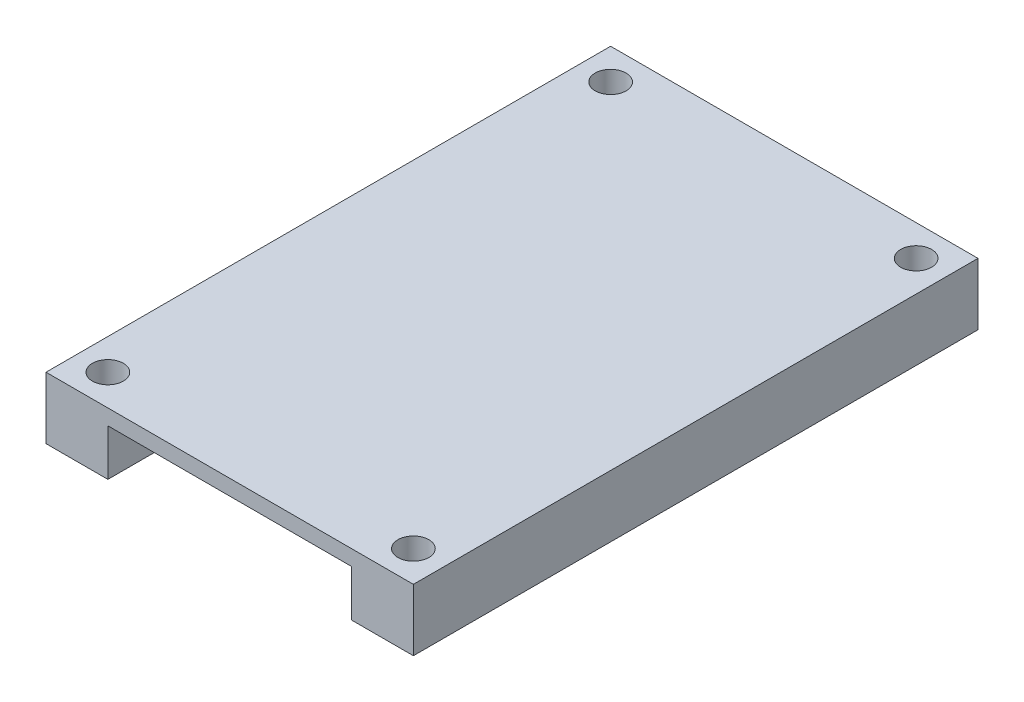
ISO-10303-21;
HEADER;
FILE_DESCRIPTION(('STEP AP214'),'2;1');
FILE_NAME('part.step','',(''),(''),'','','');
FILE_SCHEMA(('AUTOMOTIVE_DESIGN { 1 0 10303 214 1 1 1 1 }'));
ENDSEC;
DATA;
#1=APPLICATION_CONTEXT('core data for automotive mechanical design processes');
#2=APPLICATION_PROTOCOL_DEFINITION('international standard','automotive_design',2000,#1);
#3=PRODUCT_CONTEXT('',#1,'mechanical');
#4=PRODUCT('Part','Part','',(#3));
#5=PRODUCT_RELATED_PRODUCT_CATEGORY('part','',(#4));
#6=PRODUCT_DEFINITION_FORMATION('','',#4);
#7=PRODUCT_DEFINITION_CONTEXT('part definition',#1,'design');
#8=PRODUCT_DEFINITION('design','',#6,#7);
#9=PRODUCT_DEFINITION_SHAPE('','',#8);
#10=(LENGTH_UNIT() NAMED_UNIT(*) SI_UNIT(.MILLI.,.METRE.));
#11=(NAMED_UNIT(*) PLANE_ANGLE_UNIT() SI_UNIT($,.RADIAN.));
#12=(NAMED_UNIT(*) SI_UNIT($,.STERADIAN.) SOLID_ANGLE_UNIT());
#13=UNCERTAINTY_MEASURE_WITH_UNIT(LENGTH_MEASURE(1.E-05),#10,'distance_accuracy_value','');
#14=(GEOMETRIC_REPRESENTATION_CONTEXT(3) GLOBAL_UNCERTAINTY_ASSIGNED_CONTEXT((#13)) GLOBAL_UNIT_ASSIGNED_CONTEXT((#10,
#11,#12)) REPRESENTATION_CONTEXT('',''));
#15=CARTESIAN_POINT('',(0.,0.,0.));
#16=DIRECTION('',(0.,0.,1.));
#17=DIRECTION('',(1.,0.,0.));
#18=AXIS2_PLACEMENT_3D('',#15,#16,#17);
#19=CARTESIAN_POINT('',(0.,8.,0.));
#20=DIRECTION('',(0.,-1.,0.));
#21=DIRECTION('',(0.,0.,-1.));
#22=AXIS2_PLACEMENT_3D('',#19,#20,#21);
#23=PLANE('',#22);
#24=CARTESIAN_POINT('',(-114.001130157017,8.,30.6813096219935));
#25=DIRECTION('',(0.,-1.,0.));
#26=DIRECTION('',(0.,0.,-1.));
#27=AXIS2_PLACEMENT_3D('',#24,#25,#26);
#28=CIRCLE('',#27,2.);
#29=CARTESIAN_POINT('',(-114.001130157017,8.,28.6813096219935));
#30=VERTEX_POINT('',#29);
#31=EDGE_CURVE('E325',#30,#30,#28,.T.);
#32=ORIENTED_EDGE('',*,*,#31,.T.);
#33=EDGE_LOOP('',(#32));
#34=FACE_BOUND('',#33,.T.);
#35=CARTESIAN_POINT('',(-114.001130157017,8.,-34.3186903780065));
#36=DIRECTION('',(0.,1.,0.));
#37=DIRECTION('',(0.,0.,1.));
#38=AXIS2_PLACEMENT_3D('',#35,#36,#37);
#39=CIRCLE('',#38,2.);
#40=CARTESIAN_POINT('',(-114.001130157017,8.,-32.3186903780065));
#41=VERTEX_POINT('',#40);
#42=EDGE_CURVE('E322',#41,#41,#39,.T.);
#43=ORIENTED_EDGE('',*,*,#42,.F.);
#44=EDGE_LOOP('',(#43));
#45=FACE_BOUND('',#44,.T.);
#46=CARTESIAN_POINT('',(-74.5011301570172,8.,-34.3186903780065));
#47=DIRECTION('',(0.,-1.,0.));
#48=DIRECTION('',(0.,0.,-1.));
#49=AXIS2_PLACEMENT_3D('',#46,#47,#48);
#50=CIRCLE('',#49,2.);
#51=CARTESIAN_POINT('',(-74.5011301570172,8.,-36.3186903780065));
#52=VERTEX_POINT('',#51);
#53=EDGE_CURVE('E208',#52,#52,#50,.T.);
#54=ORIENTED_EDGE('',*,*,#53,.T.);
#55=EDGE_LOOP('',(#54));
#56=FACE_BOUND('',#55,.T.);
#57=DIRECTION('',(1.,0.,0.));
#58=VECTOR('',#57,1.);
#59=CARTESIAN_POINT('',(-118.001130157017,8.,-38.3186903780065));
#60=LINE('',#59,#58);
#61=CARTESIAN_POINT('',(-118.001130157017,8.,-38.3186903780065));
#62=VERTEX_POINT('',#61);
#63=CARTESIAN_POINT('',(-70.5011301570173,8.,-38.3186903780065));
#64=VERTEX_POINT('',#63);
#65=EDGE_CURVE('E252',#62,#64,#60,.T.);
#66=ORIENTED_EDGE('',*,*,#65,.F.);
#67=DIRECTION('',(0.,0.,1.));
#68=VECTOR('',#67,1.);
#69=CARTESIAN_POINT('',(-118.001130157017,8.,-38.3186903780065));
#70=LINE('',#69,#68);
#71=CARTESIAN_POINT('',(-118.001130157017,8.,34.6813096219935));
#72=VERTEX_POINT('',#71);
#73=EDGE_CURVE('E259',#62,#72,#70,.T.);
#74=ORIENTED_EDGE('',*,*,#73,.T.);
#75=DIRECTION('',(1.,0.,0.));
#76=VECTOR('',#75,1.);
#77=CARTESIAN_POINT('',(-118.001130157017,8.,34.6813096219935));
#78=LINE('',#77,#76);
#79=CARTESIAN_POINT('',(-70.5011301570172,8.,34.6813096219935));
#80=VERTEX_POINT('',#79);
#81=EDGE_CURVE('E257',#72,#80,#78,.T.);
#82=ORIENTED_EDGE('',*,*,#81,.T.);
#83=DIRECTION('',(0.,0.,1.));
#84=VECTOR('',#83,1.);
#85=CARTESIAN_POINT('',(-70.5011301570173,8.,-38.3186903780065));
#86=LINE('',#85,#84);
#87=EDGE_CURVE('E254',#64,#80,#86,.T.);
#88=ORIENTED_EDGE('',*,*,#87,.F.);
#89=EDGE_LOOP('',(#66,#74,#82,#88));
#90=FACE_BOUND('',#89,.T.);
#91=CARTESIAN_POINT('',(-74.5011301570172,8.,30.6813096219935));
#92=DIRECTION('',(0.,1.,0.));
#93=DIRECTION('',(0.,0.,1.));
#94=AXIS2_PLACEMENT_3D('',#91,#92,#93);
#95=CIRCLE('',#94,2.);
#96=CARTESIAN_POINT('',(-74.5011301570172,8.,32.6813096219935));
#97=VERTEX_POINT('',#96);
#98=EDGE_CURVE('E316',#97,#97,#95,.T.);
#99=ORIENTED_EDGE('',*,*,#98,.F.);
#100=EDGE_LOOP('',(#99));
#101=FACE_BOUND('',#100,.T.);
#102=ADVANCED_FACE('F33',(#34,#45,#56,#90,#101),#23,.F.);
#103=CARTESIAN_POINT('',(0.,0.,0.));
#104=DIRECTION('',(0.,-1.,0.));
#105=DIRECTION('',(0.,0.,-1.));
#106=AXIS2_PLACEMENT_3D('',#103,#104,#105);
#107=PLANE('',#106);
#108=DIRECTION('',(0.,0.,1.));
#109=VECTOR('',#108,1.);
#110=CARTESIAN_POINT('',(-78.5011301570172,0.,0.));
#111=LINE('',#110,#109);
#112=CARTESIAN_POINT('',(-78.5011301570172,0.,-38.3186903780065));
#113=VERTEX_POINT('',#112);
#114=CARTESIAN_POINT('',(-78.5011301570172,0.,-30.3186903780065));
#115=VERTEX_POINT('',#114);
#116=EDGE_CURVE('E210',#113,#115,#111,.T.);
#117=ORIENTED_EDGE('',*,*,#116,.F.);
#118=DIRECTION('',(1.,0.,0.));
#119=VECTOR('',#118,1.);
#120=CARTESIAN_POINT('',(-118.001130157017,0.,-38.3186903780065));
#121=LINE('',#120,#119);
#122=CARTESIAN_POINT('',(-70.5011301570173,0.,-38.3186903780065));
#123=VERTEX_POINT('',#122);
#124=EDGE_CURVE('E161',#113,#123,#121,.T.);
#125=ORIENTED_EDGE('',*,*,#124,.T.);
#126=DIRECTION('',(0.,0.,1.));
#127=VECTOR('',#126,1.);
#128=CARTESIAN_POINT('',(-70.5011301570173,0.,-38.3186903780065));
#129=LINE('',#128,#127);
#130=CARTESIAN_POINT('',(-70.5011301570172,0.,34.6813096219935));
#131=VERTEX_POINT('',#130);
#132=EDGE_CURVE('E264',#123,#131,#129,.T.);
#133=ORIENTED_EDGE('',*,*,#132,.T.);
#134=DIRECTION('',(1.,0.,0.));
#135=VECTOR('',#134,1.);
#136=CARTESIAN_POINT('',(-118.001130157017,0.,34.6813096219935));
#137=LINE('',#136,#135);
#138=CARTESIAN_POINT('',(-78.5011301570172,0.,34.6813096219935));
#139=VERTEX_POINT('',#138);
#140=EDGE_CURVE('E267',#139,#131,#137,.T.);
#141=ORIENTED_EDGE('',*,*,#140,.F.);
#142=DIRECTION('',(0.,0.,-1.));
#143=VECTOR('',#142,1.);
#144=CARTESIAN_POINT('',(-78.5011301570172,0.,0.));
#145=LINE('',#144,#143);
#146=CARTESIAN_POINT('',(-78.5011301570172,0.,26.6813096219935));
#147=VERTEX_POINT('',#146);
#148=EDGE_CURVE('E179',#139,#147,#145,.T.);
#149=ORIENTED_EDGE('',*,*,#148,.T.);
#150=DIRECTION('',(-1.,0.,0.));
#151=VECTOR('',#150,1.);
#152=CARTESIAN_POINT('',(0.,0.,26.6813096219935));
#153=LINE('',#152,#151);
#154=CARTESIAN_POINT('',(-74.5011301570172,0.,26.6813096219935));
#155=VERTEX_POINT('',#154);
#156=EDGE_CURVE('E176',#155,#147,#153,.T.);
#157=ORIENTED_EDGE('',*,*,#156,.F.);
#158=DIRECTION('',(0.,0.,1.));
#159=VECTOR('',#158,1.);
#160=CARTESIAN_POINT('',(-74.5011301570172,0.,0.));
#161=LINE('',#160,#159);
#162=CARTESIAN_POINT('',(-74.5011301570172,0.,-30.3186903780065));
#163=VERTEX_POINT('',#162);
#164=EDGE_CURVE('E50',#163,#155,#161,.T.);
#165=ORIENTED_EDGE('',*,*,#164,.F.);
#166=DIRECTION('',(-1.,0.,0.));
#167=VECTOR('',#166,1.);
#168=CARTESIAN_POINT('',(0.,0.,-30.3186903780065));
#169=LINE('',#168,#167);
#170=EDGE_CURVE('E159',#163,#115,#169,.T.);
#171=ORIENTED_EDGE('',*,*,#170,.T.);
#172=EDGE_LOOP('',(#117,#125,#133,#141,#149,#157,#165,#171));
#173=FACE_BOUND('',#172,.T.);
#174=CARTESIAN_POINT('',(-74.5011301570172,0.,-34.3186903780065));
#175=DIRECTION('',(0.,-1.,0.));
#176=DIRECTION('',(0.,0.,-1.));
#177=AXIS2_PLACEMENT_3D('',#174,#175,#176);
#178=CIRCLE('',#177,2.);
#179=CARTESIAN_POINT('',(-74.5011301570172,0.,-36.3186903780065));
#180=VERTEX_POINT('',#179);
#181=EDGE_CURVE('E182',#180,#180,#178,.T.);
#182=ORIENTED_EDGE('',*,*,#181,.F.);
#183=EDGE_LOOP('',(#182));
#184=FACE_BOUND('',#183,.T.);
#185=CARTESIAN_POINT('',(-74.5011301570172,0.,30.6813096219935));
#186=DIRECTION('',(0.,1.,0.));
#187=DIRECTION('',(0.,0.,1.));
#188=AXIS2_PLACEMENT_3D('',#185,#186,#187);
#189=CIRCLE('',#188,2.);
#190=CARTESIAN_POINT('',(-74.5011301570172,0.,32.6813096219935));
#191=VERTEX_POINT('',#190);
#192=EDGE_CURVE('E318',#191,#191,#189,.T.);
#193=ORIENTED_EDGE('',*,*,#192,.T.);
#194=EDGE_LOOP('',(#193));
#195=FACE_BOUND('',#194,.T.);
#196=ADVANCED_FACE('F283',(#173,#184,#195),#107,.T.);
#197=CARTESIAN_POINT('',(-114.001130157017,0.,30.6813096219935));
#198=DIRECTION('',(0.,-1.,0.));
#199=DIRECTION('',(0.,0.,-1.));
#200=AXIS2_PLACEMENT_3D('',#197,#198,#199);
#201=CIRCLE('',#200,2.);
#202=CARTESIAN_POINT('',(-114.001130157017,0.,28.6813096219935));
#203=VERTEX_POINT('',#202);
#204=EDGE_CURVE('E319',#203,#203,#201,.T.);
#205=ORIENTED_EDGE('',*,*,#204,.F.);
#206=EDGE_LOOP('',(#205));
#207=FACE_BOUND('',#206,.T.);
#208=CARTESIAN_POINT('',(-118.001130157017,0.,-38.3186903780065));
#209=VERTEX_POINT('',#208);
#210=CARTESIAN_POINT('',(-110.001130157017,0.,-38.3186903780065));
#211=VERTEX_POINT('',#210);
#212=EDGE_CURVE('E261',#209,#211,#121,.T.);
#213=ORIENTED_EDGE('',*,*,#212,.T.);
#214=DIRECTION('',(0.,0.,1.));
#215=VECTOR('',#214,1.);
#216=CARTESIAN_POINT('',(-110.001130157017,0.,0.));
#217=LINE('',#216,#215);
#218=CARTESIAN_POINT('',(-110.001130157017,0.,-30.3186903780065));
#219=VERTEX_POINT('',#218);
#220=EDGE_CURVE('E213',#211,#219,#217,.T.);
#221=ORIENTED_EDGE('',*,*,#220,.T.);
#222=DIRECTION('',(1.,0.,0.));
#223=VECTOR('',#222,1.);
#224=CARTESIAN_POINT('',(0.,0.,-30.3186903780065));
#225=LINE('',#224,#223);
#226=CARTESIAN_POINT('',(-114.001130157017,0.,-30.3186903780065));
#227=VERTEX_POINT('',#226);
#228=EDGE_CURVE('E216',#227,#219,#225,.T.);
#229=ORIENTED_EDGE('',*,*,#228,.F.);
#230=DIRECTION('',(0.,0.,1.));
#231=VECTOR('',#230,1.);
#232=CARTESIAN_POINT('',(-114.001130157017,0.,0.));
#233=LINE('',#232,#231);
#234=CARTESIAN_POINT('',(-114.001130157017,0.,26.6813096219935));
#235=VERTEX_POINT('',#234);
#236=EDGE_CURVE('E219',#227,#235,#233,.T.);
#237=ORIENTED_EDGE('',*,*,#236,.T.);
#238=DIRECTION('',(1.,0.,0.));
#239=VECTOR('',#238,1.);
#240=CARTESIAN_POINT('',(0.,0.,26.6813096219935));
#241=LINE('',#240,#239);
#242=CARTESIAN_POINT('',(-110.001130157017,0.,26.6813096219935));
#243=VERTEX_POINT('',#242);
#244=EDGE_CURVE('E222',#235,#243,#241,.T.);
#245=ORIENTED_EDGE('',*,*,#244,.T.);
#246=DIRECTION('',(0.,0.,-1.));
#247=VECTOR('',#246,1.);
#248=CARTESIAN_POINT('',(-110.001130157017,0.,0.));
#249=LINE('',#248,#247);
#250=CARTESIAN_POINT('',(-110.001130157017,0.,34.6813096219935));
#251=VERTEX_POINT('',#250);
#252=EDGE_CURVE('E225',#251,#243,#249,.T.);
#253=ORIENTED_EDGE('',*,*,#252,.F.);
#254=CARTESIAN_POINT('',(-118.001130157017,0.,34.6813096219935));
#255=VERTEX_POINT('',#254);
#256=EDGE_CURVE('E268',#255,#251,#137,.T.);
#257=ORIENTED_EDGE('',*,*,#256,.F.);
#258=DIRECTION('',(0.,0.,1.));
#259=VECTOR('',#258,1.);
#260=CARTESIAN_POINT('',(-118.001130157017,0.,-38.3186903780065));
#261=LINE('',#260,#259);
#262=EDGE_CURVE('E255',#209,#255,#261,.T.);
#263=ORIENTED_EDGE('',*,*,#262,.F.);
#264=EDGE_LOOP('',(#213,#221,#229,#237,#245,#253,#257,#263));
#265=FACE_BOUND('',#264,.T.);
#266=CARTESIAN_POINT('',(-114.001130157017,0.,-34.3186903780065));
#267=DIRECTION('',(0.,1.,0.));
#268=DIRECTION('',(0.,0.,1.));
#269=AXIS2_PLACEMENT_3D('',#266,#267,#268);
#270=CIRCLE('',#269,2.);
#271=CARTESIAN_POINT('',(-114.001130157017,0.,-32.3186903780065));
#272=VERTEX_POINT('',#271);
#273=EDGE_CURVE('E329',#272,#272,#270,.T.);
#274=ORIENTED_EDGE('',*,*,#273,.T.);
#275=EDGE_LOOP('',(#274));
#276=FACE_BOUND('',#275,.T.);
#277=ADVANCED_FACE('F299',(#207,#265,#276),#107,.T.);
#278=CARTESIAN_POINT('',(-118.001130157017,8.,-38.3186903780065));
#279=DIRECTION('',(0.,0.,-1.));
#280=DIRECTION('',(-1.,0.,0.));
#281=AXIS2_PLACEMENT_3D('',#278,#279,#280);
#282=PLANE('',#281);
#283=DIRECTION('',(0.,-1.,0.));
#284=VECTOR('',#283,1.);
#285=CARTESIAN_POINT('',(-78.5011301570172,6.,-38.3186903780065));
#286=LINE('',#285,#284);
#287=CARTESIAN_POINT('',(-78.5011301570172,6.,-38.3186903780065));
#288=VERTEX_POINT('',#287);
#289=EDGE_CURVE('E249',#288,#113,#286,.T.);
#290=ORIENTED_EDGE('',*,*,#289,.F.);
#291=DIRECTION('',(1.,0.,0.));
#292=VECTOR('',#291,1.);
#293=CARTESIAN_POINT('',(0.,6.,-38.3186903780065));
#294=LINE('',#293,#292);
#295=CARTESIAN_POINT('',(-110.001130157017,6.,-38.3186903780065));
#296=VERTEX_POINT('',#295);
#297=EDGE_CURVE('E186',#296,#288,#294,.T.);
#298=ORIENTED_EDGE('',*,*,#297,.F.);
#299=DIRECTION('',(0.,-1.,0.));
#300=VECTOR('',#299,1.);
#301=CARTESIAN_POINT('',(-110.001130157017,6.,-38.3186903780065));
#302=LINE('',#301,#300);
#303=EDGE_CURVE('E246',#296,#211,#302,.T.);
#304=ORIENTED_EDGE('',*,*,#303,.T.);
#305=ORIENTED_EDGE('',*,*,#212,.F.);
#306=DIRECTION('',(0.,-1.,0.));
#307=VECTOR('',#306,1.);
#308=CARTESIAN_POINT('',(-118.001130157017,8.,-38.3186903780065));
#309=LINE('',#308,#307);
#310=EDGE_CURVE('E11',#62,#209,#309,.T.);
#311=ORIENTED_EDGE('',*,*,#310,.F.);
#312=ORIENTED_EDGE('',*,*,#65,.T.);
#313=DIRECTION('',(0.,-1.,0.));
#314=VECTOR('',#313,1.);
#315=CARTESIAN_POINT('',(-70.5011301570173,8.,-38.3186903780065));
#316=LINE('',#315,#314);
#317=EDGE_CURVE('E37',#64,#123,#316,.T.);
#318=ORIENTED_EDGE('',*,*,#317,.T.);
#319=ORIENTED_EDGE('',*,*,#124,.F.);
#320=EDGE_LOOP('',(#290,#298,#304,#305,#311,#312,#318,#319));
#321=FACE_BOUND('',#320,.T.);
#322=ADVANCED_FACE('F35',(#321),#282,.T.);
#323=CARTESIAN_POINT('',(-118.001130157017,8.,-38.3186903780065));
#324=DIRECTION('',(1.,0.,0.));
#325=DIRECTION('',(0.,0.,-1.));
#326=AXIS2_PLACEMENT_3D('',#323,#324,#325);
#327=PLANE('',#326);
#328=ORIENTED_EDGE('',*,*,#262,.T.);
#329=DIRECTION('',(0.,-1.,0.));
#330=VECTOR('',#329,1.);
#331=CARTESIAN_POINT('',(-118.001130157017,8.,34.6813096219935));
#332=LINE('',#331,#330);
#333=EDGE_CURVE('E42',#72,#255,#332,.T.);
#334=ORIENTED_EDGE('',*,*,#333,.F.);
#335=ORIENTED_EDGE('',*,*,#73,.F.);
#336=ORIENTED_EDGE('',*,*,#310,.T.);
#337=EDGE_LOOP('',(#328,#334,#335,#336));
#338=FACE_BOUND('',#337,.T.);
#339=ADVANCED_FACE('F304',(#338),#327,.F.);
#340=CARTESIAN_POINT('',(-118.001130157017,8.,34.6813096219935));
#341=DIRECTION('',(0.,0.,-1.));
#342=DIRECTION('',(-1.,0.,0.));
#343=AXIS2_PLACEMENT_3D('',#340,#341,#342);
#344=PLANE('',#343);
#345=ORIENTED_EDGE('',*,*,#256,.T.);
#346=DIRECTION('',(0.,-1.,0.));
#347=VECTOR('',#346,1.);
#348=CARTESIAN_POINT('',(-110.001130157017,6.,34.6813096219935));
#349=LINE('',#348,#347);
#350=CARTESIAN_POINT('',(-110.001130157017,6.,34.6813096219935));
#351=VERTEX_POINT('',#350);
#352=EDGE_CURVE('E236',#351,#251,#349,.T.);
#353=ORIENTED_EDGE('',*,*,#352,.F.);
#354=DIRECTION('',(1.,0.,0.));
#355=VECTOR('',#354,1.);
#356=CARTESIAN_POINT('',(0.,6.,34.6813096219935));
#357=LINE('',#356,#355);
#358=CARTESIAN_POINT('',(-78.5011301570172,6.,34.6813096219935));
#359=VERTEX_POINT('',#358);
#360=EDGE_CURVE('E200',#351,#359,#357,.T.);
#361=ORIENTED_EDGE('',*,*,#360,.T.);
#362=DIRECTION('',(0.,-1.,0.));
#363=VECTOR('',#362,1.);
#364=CARTESIAN_POINT('',(-78.5011301570172,6.,34.6813096219935));
#365=LINE('',#364,#363);
#366=EDGE_CURVE('E233',#359,#139,#365,.T.);
#367=ORIENTED_EDGE('',*,*,#366,.T.);
#368=ORIENTED_EDGE('',*,*,#140,.T.);
#369=DIRECTION('',(0.,-1.,0.));
#370=VECTOR('',#369,1.);
#371=CARTESIAN_POINT('',(-70.5011301570172,8.,34.6813096219935));
#372=LINE('',#371,#370);
#373=EDGE_CURVE('E273',#80,#131,#372,.T.);
#374=ORIENTED_EDGE('',*,*,#373,.F.);
#375=ORIENTED_EDGE('',*,*,#81,.F.);
#376=ORIENTED_EDGE('',*,*,#333,.T.);
#377=EDGE_LOOP('',(#345,#353,#361,#367,#368,#374,#375,#376));
#378=FACE_BOUND('',#377,.T.);
#379=ADVANCED_FACE('F307',(#378),#344,.F.);
#380=CARTESIAN_POINT('',(-70.5011301570173,8.,-38.3186903780065));
#381=DIRECTION('',(1.,0.,0.));
#382=DIRECTION('',(0.,0.,-1.));
#383=AXIS2_PLACEMENT_3D('',#380,#381,#382);
#384=PLANE('',#383);
#385=ORIENTED_EDGE('',*,*,#132,.F.);
#386=ORIENTED_EDGE('',*,*,#317,.F.);
#387=ORIENTED_EDGE('',*,*,#87,.T.);
#388=ORIENTED_EDGE('',*,*,#373,.T.);
#389=EDGE_LOOP('',(#385,#386,#387,#388));
#390=FACE_BOUND('',#389,.T.);
#391=ADVANCED_FACE('F279',(#390),#384,.T.);
#392=CARTESIAN_POINT('',(-74.5011301570172,6.,0.));
#393=DIRECTION('',(1.,0.,0.));
#394=DIRECTION('',(0.,0.,-1.));
#395=AXIS2_PLACEMENT_3D('',#392,#393,#394);
#396=PLANE('',#395);
#397=ORIENTED_EDGE('',*,*,#164,.T.);
#398=DIRECTION('',(0.,-1.,0.));
#399=VECTOR('',#398,1.);
#400=CARTESIAN_POINT('',(-74.5011301570172,6.,26.6813096219935));
#401=LINE('',#400,#399);
#402=CARTESIAN_POINT('',(-74.5011301570172,6.,26.6813096219935));
#403=VERTEX_POINT('',#402);
#404=EDGE_CURVE('E175',#403,#155,#401,.T.);
#405=ORIENTED_EDGE('',*,*,#404,.F.);
#406=DIRECTION('',(0.,0.,1.));
#407=VECTOR('',#406,1.);
#408=CARTESIAN_POINT('',(-74.5011301570172,6.,0.));
#409=LINE('',#408,#407);
#410=CARTESIAN_POINT('',(-74.5011301570172,6.,-30.3186903780065));
#411=VERTEX_POINT('',#410);
#412=EDGE_CURVE('E169',#411,#403,#409,.T.);
#413=ORIENTED_EDGE('',*,*,#412,.F.);
#414=DIRECTION('',(0.,-1.,0.));
#415=VECTOR('',#414,1.);
#416=CARTESIAN_POINT('',(-74.5011301570172,6.,-30.3186903780065));
#417=LINE('',#416,#415);
#418=EDGE_CURVE('E153',#411,#163,#417,.T.);
#419=ORIENTED_EDGE('',*,*,#418,.T.);
#420=EDGE_LOOP('',(#397,#405,#413,#419));
#421=FACE_BOUND('',#420,.T.);
#422=ADVANCED_FACE('F174',(#421),#396,.F.);
#423=CARTESIAN_POINT('',(0.,6.,-30.3186903780065));
#424=DIRECTION('',(0.,0.,1.));
#425=DIRECTION('',(1.,0.,0.));
#426=AXIS2_PLACEMENT_3D('',#423,#424,#425);
#427=PLANE('',#426);
#428=ORIENTED_EDGE('',*,*,#170,.F.);
#429=ORIENTED_EDGE('',*,*,#418,.F.);
#430=DIRECTION('',(-1.,0.,0.));
#431=VECTOR('',#430,1.);
#432=CARTESIAN_POINT('',(0.,6.,-30.3186903780065));
#433=LINE('',#432,#431);
#434=CARTESIAN_POINT('',(-78.5011301570172,6.,-30.3186903780065));
#435=VERTEX_POINT('',#434);
#436=EDGE_CURVE('E156',#411,#435,#433,.T.);
#437=ORIENTED_EDGE('',*,*,#436,.T.);
#438=DIRECTION('',(0.,-1.,0.));
#439=VECTOR('',#438,1.);
#440=CARTESIAN_POINT('',(-78.5011301570172,6.,-30.3186903780065));
#441=LINE('',#440,#439);
#442=EDGE_CURVE('E162',#435,#115,#441,.T.);
#443=ORIENTED_EDGE('',*,*,#442,.T.);
#444=EDGE_LOOP('',(#428,#429,#437,#443));
#445=FACE_BOUND('',#444,.T.);
#446=ADVANCED_FACE('F155',(#445),#427,.T.);
#447=CARTESIAN_POINT('',(-78.5011301570172,6.,0.));
#448=DIRECTION('',(1.,0.,0.));
#449=DIRECTION('',(0.,0.,-1.));
#450=AXIS2_PLACEMENT_3D('',#447,#448,#449);
#451=PLANE('',#450);
#452=ORIENTED_EDGE('',*,*,#116,.T.);
#453=ORIENTED_EDGE('',*,*,#442,.F.);
#454=DIRECTION('',(0.,0.,1.));
#455=VECTOR('',#454,1.);
#456=CARTESIAN_POINT('',(-78.5011301570172,6.,0.));
#457=LINE('',#456,#455);
#458=EDGE_CURVE('E172',#288,#435,#457,.T.);
#459=ORIENTED_EDGE('',*,*,#458,.F.);
#460=ORIENTED_EDGE('',*,*,#289,.T.);
#461=EDGE_LOOP('',(#452,#453,#459,#460));
#462=FACE_BOUND('',#461,.T.);
#463=ADVANCED_FACE('F286',(#462),#451,.F.);
#464=CARTESIAN_POINT('',(-110.001130157017,6.,0.));
#465=DIRECTION('',(1.,0.,0.));
#466=DIRECTION('',(0.,0.,-1.));
#467=AXIS2_PLACEMENT_3D('',#464,#465,#466);
#468=PLANE('',#467);
#469=ORIENTED_EDGE('',*,*,#220,.F.);
#470=ORIENTED_EDGE('',*,*,#303,.F.);
#471=DIRECTION('',(0.,0.,1.));
#472=VECTOR('',#471,1.);
#473=CARTESIAN_POINT('',(-110.001130157017,6.,0.));
#474=LINE('',#473,#472);
#475=CARTESIAN_POINT('',(-110.001130157017,6.,-30.3186903780065));
#476=VERTEX_POINT('',#475);
#477=EDGE_CURVE('E188',#296,#476,#474,.T.);
#478=ORIENTED_EDGE('',*,*,#477,.T.);
#479=DIRECTION('',(0.,-1.,0.));
#480=VECTOR('',#479,1.);
#481=CARTESIAN_POINT('',(-110.001130157017,6.,-30.3186903780065));
#482=LINE('',#481,#480);
#483=EDGE_CURVE('E244',#476,#219,#482,.T.);
#484=ORIENTED_EDGE('',*,*,#483,.T.);
#485=EDGE_LOOP('',(#469,#470,#478,#484));
#486=FACE_BOUND('',#485,.T.);
#487=ADVANCED_FACE('F293',(#486),#468,.T.);
#488=CARTESIAN_POINT('',(0.,6.,-30.3186903780065));
#489=DIRECTION('',(0.,0.,-1.));
#490=DIRECTION('',(-1.,0.,0.));
#491=AXIS2_PLACEMENT_3D('',#488,#489,#490);
#492=PLANE('',#491);
#493=ORIENTED_EDGE('',*,*,#228,.T.);
#494=ORIENTED_EDGE('',*,*,#483,.F.);
#495=DIRECTION('',(1.,0.,0.));
#496=VECTOR('',#495,1.);
#497=CARTESIAN_POINT('',(0.,6.,-30.3186903780065));
#498=LINE('',#497,#496);
#499=CARTESIAN_POINT('',(-114.001130157017,6.,-30.3186903780065));
#500=VERTEX_POINT('',#499);
#501=EDGE_CURVE('E190',#500,#476,#498,.T.);
#502=ORIENTED_EDGE('',*,*,#501,.F.);
#503=DIRECTION('',(0.,-1.,0.));
#504=VECTOR('',#503,1.);
#505=CARTESIAN_POINT('',(-114.001130157017,6.,-30.3186903780065));
#506=LINE('',#505,#504);
#507=EDGE_CURVE('E242',#500,#227,#506,.T.);
#508=ORIENTED_EDGE('',*,*,#507,.T.);
#509=EDGE_LOOP('',(#493,#494,#502,#508));
#510=FACE_BOUND('',#509,.T.);
#511=ADVANCED_FACE('F295',(#510),#492,.F.);
#512=CARTESIAN_POINT('',(-114.001130157017,6.,0.));
#513=DIRECTION('',(1.,0.,0.));
#514=DIRECTION('',(0.,0.,-1.));
#515=AXIS2_PLACEMENT_3D('',#512,#513,#514);
#516=PLANE('',#515);
#517=ORIENTED_EDGE('',*,*,#236,.F.);
#518=ORIENTED_EDGE('',*,*,#507,.F.);
#519=DIRECTION('',(0.,0.,1.));
#520=VECTOR('',#519,1.);
#521=CARTESIAN_POINT('',(-114.001130157017,6.,0.));
#522=LINE('',#521,#520);
#523=CARTESIAN_POINT('',(-114.001130157017,6.,26.6813096219935));
#524=VERTEX_POINT('',#523);
#525=EDGE_CURVE('E193',#500,#524,#522,.T.);
#526=ORIENTED_EDGE('',*,*,#525,.T.);
#527=DIRECTION('',(0.,-1.,0.));
#528=VECTOR('',#527,1.);
#529=CARTESIAN_POINT('',(-114.001130157017,6.,26.6813096219935));
#530=LINE('',#529,#528);
#531=EDGE_CURVE('E240',#524,#235,#530,.T.);
#532=ORIENTED_EDGE('',*,*,#531,.T.);
#533=EDGE_LOOP('',(#517,#518,#526,#532));
#534=FACE_BOUND('',#533,.T.);
#535=ADVANCED_FACE('F379',(#534),#516,.T.);
#536=CARTESIAN_POINT('',(0.,6.,26.6813096219935));
#537=DIRECTION('',(0.,0.,-1.));
#538=DIRECTION('',(-1.,0.,0.));
#539=AXIS2_PLACEMENT_3D('',#536,#537,#538);
#540=PLANE('',#539);
#541=ORIENTED_EDGE('',*,*,#244,.F.);
#542=ORIENTED_EDGE('',*,*,#531,.F.);
#543=DIRECTION('',(1.,0.,0.));
#544=VECTOR('',#543,1.);
#545=CARTESIAN_POINT('',(0.,6.,26.6813096219935));
#546=LINE('',#545,#544);
#547=CARTESIAN_POINT('',(-110.001130157017,6.,26.6813096219935));
#548=VERTEX_POINT('',#547);
#549=EDGE_CURVE('E195',#524,#548,#546,.T.);
#550=ORIENTED_EDGE('',*,*,#549,.T.);
#551=DIRECTION('',(0.,-1.,0.));
#552=VECTOR('',#551,1.);
#553=CARTESIAN_POINT('',(-110.001130157017,6.,26.6813096219935));
#554=LINE('',#553,#552);
#555=EDGE_CURVE('E238',#548,#243,#554,.T.);
#556=ORIENTED_EDGE('',*,*,#555,.T.);
#557=EDGE_LOOP('',(#541,#542,#550,#556));
#558=FACE_BOUND('',#557,.T.);
#559=ADVANCED_FACE('F375',(#558),#540,.T.);
#560=CARTESIAN_POINT('',(-110.001130157017,6.,0.));
#561=DIRECTION('',(-1.,0.,0.));
#562=DIRECTION('',(0.,0.,1.));
#563=AXIS2_PLACEMENT_3D('',#560,#561,#562);
#564=PLANE('',#563);
#565=ORIENTED_EDGE('',*,*,#252,.T.);
#566=ORIENTED_EDGE('',*,*,#555,.F.);
#567=DIRECTION('',(0.,0.,-1.));
#568=VECTOR('',#567,1.);
#569=CARTESIAN_POINT('',(-110.001130157017,6.,0.));
#570=LINE('',#569,#568);
#571=EDGE_CURVE('E197',#351,#548,#570,.T.);
#572=ORIENTED_EDGE('',*,*,#571,.F.);
#573=ORIENTED_EDGE('',*,*,#352,.T.);
#574=EDGE_LOOP('',(#565,#566,#572,#573));
#575=FACE_BOUND('',#574,.T.);
#576=ADVANCED_FACE('F371',(#575),#564,.F.);
#577=CARTESIAN_POINT('',(-78.5011301570172,6.,0.));
#578=DIRECTION('',(-1.,0.,0.));
#579=DIRECTION('',(0.,0.,1.));
#580=AXIS2_PLACEMENT_3D('',#577,#578,#579);
#581=PLANE('',#580);
#582=ORIENTED_EDGE('',*,*,#148,.F.);
#583=ORIENTED_EDGE('',*,*,#366,.F.);
#584=DIRECTION('',(0.,0.,-1.));
#585=VECTOR('',#584,1.);
#586=CARTESIAN_POINT('',(-78.5011301570172,6.,0.));
#587=LINE('',#586,#585);
#588=CARTESIAN_POINT('',(-78.5011301570172,6.,26.6813096219935));
#589=VERTEX_POINT('',#588);
#590=EDGE_CURVE('E203',#359,#589,#587,.T.);
#591=ORIENTED_EDGE('',*,*,#590,.T.);
#592=DIRECTION('',(0.,-1.,0.));
#593=VECTOR('',#592,1.);
#594=CARTESIAN_POINT('',(-78.5011301570172,6.,26.6813096219935));
#595=LINE('',#594,#593);
#596=EDGE_CURVE('E231',#589,#147,#595,.T.);
#597=ORIENTED_EDGE('',*,*,#596,.T.);
#598=EDGE_LOOP('',(#582,#583,#591,#597));
#599=FACE_BOUND('',#598,.T.);
#600=ADVANCED_FACE('F367',(#599),#581,.T.);
#601=CARTESIAN_POINT('',(0.,6.,26.6813096219935));
#602=DIRECTION('',(0.,0.,1.));
#603=DIRECTION('',(1.,0.,0.));
#604=AXIS2_PLACEMENT_3D('',#601,#602,#603);
#605=PLANE('',#604);
#606=ORIENTED_EDGE('',*,*,#156,.T.);
#607=ORIENTED_EDGE('',*,*,#596,.F.);
#608=DIRECTION('',(-1.,0.,0.));
#609=VECTOR('',#608,1.);
#610=CARTESIAN_POINT('',(0.,6.,26.6813096219935));
#611=LINE('',#610,#609);
#612=EDGE_CURVE('E205',#403,#589,#611,.T.);
#613=ORIENTED_EDGE('',*,*,#612,.F.);
#614=ORIENTED_EDGE('',*,*,#404,.T.);
#615=EDGE_LOOP('',(#606,#607,#613,#614));
#616=FACE_BOUND('',#615,.T.);
#617=ADVANCED_FACE('F364',(#616),#605,.F.);
#618=CARTESIAN_POINT('',(0.,6.,0.));
#619=DIRECTION('',(0.,1.,0.));
#620=DIRECTION('',(0.,0.,1.));
#621=AXIS2_PLACEMENT_3D('',#618,#619,#620);
#622=PLANE('',#621);
#623=ORIENTED_EDGE('',*,*,#412,.T.);
#624=ORIENTED_EDGE('',*,*,#612,.T.);
#625=ORIENTED_EDGE('',*,*,#590,.F.);
#626=ORIENTED_EDGE('',*,*,#360,.F.);
#627=ORIENTED_EDGE('',*,*,#571,.T.);
#628=ORIENTED_EDGE('',*,*,#549,.F.);
#629=ORIENTED_EDGE('',*,*,#525,.F.);
#630=ORIENTED_EDGE('',*,*,#501,.T.);
#631=ORIENTED_EDGE('',*,*,#477,.F.);
#632=ORIENTED_EDGE('',*,*,#297,.T.);
#633=ORIENTED_EDGE('',*,*,#458,.T.);
#634=ORIENTED_EDGE('',*,*,#436,.F.);
#635=EDGE_LOOP('',(#623,#624,#625,#626,#627,#628,#629,#630,#631,#632,#633,#634));
#636=FACE_BOUND('',#635,.T.);
#637=ADVANCED_FACE('F167',(#636),#622,.F.);
#638=CARTESIAN_POINT('',(-74.5011301570172,8.,-34.3186903780065));
#639=DIRECTION('',(0.,-1.,0.));
#640=DIRECTION('',(0.,0.,-1.));
#641=AXIS2_PLACEMENT_3D('',#638,#639,#640);
#642=CYLINDRICAL_SURFACE('',#641,2.);
#643=ORIENTED_EDGE('',*,*,#53,.F.);
#644=EDGE_LOOP('',(#643));
#645=FACE_BOUND('',#644,.T.);
#646=ORIENTED_EDGE('',*,*,#181,.T.);
#647=EDGE_LOOP('',(#646));
#648=FACE_BOUND('',#647,.T.);
#649=ADVANCED_FACE('F339',(#645,#648),#642,.F.);
#650=CARTESIAN_POINT('',(-114.001130157017,8.,-34.3186903780065));
#651=DIRECTION('',(0.,-1.,0.));
#652=DIRECTION('',(0.,0.,-1.));
#653=AXIS2_PLACEMENT_3D('',#650,#651,#652);
#654=CYLINDRICAL_SURFACE('',#653,2.);
#655=ORIENTED_EDGE('',*,*,#42,.T.);
#656=EDGE_LOOP('',(#655));
#657=FACE_BOUND('',#656,.T.);
#658=ORIENTED_EDGE('',*,*,#273,.F.);
#659=EDGE_LOOP('',(#658));
#660=FACE_BOUND('',#659,.T.);
#661=ADVANCED_FACE('F348',(#657,#660),#654,.F.);
#662=CARTESIAN_POINT('',(-74.5011301570172,8.,30.6813096219935));
#663=DIRECTION('',(0.,-1.,0.));
#664=DIRECTION('',(0.,0.,-1.));
#665=AXIS2_PLACEMENT_3D('',#662,#663,#664);
#666=CYLINDRICAL_SURFACE('',#665,2.);
#667=ORIENTED_EDGE('',*,*,#98,.T.);
#668=EDGE_LOOP('',(#667));
#669=FACE_BOUND('',#668,.T.);
#670=ORIENTED_EDGE('',*,*,#192,.F.);
#671=EDGE_LOOP('',(#670));
#672=FACE_BOUND('',#671,.T.);
#673=ADVANCED_FACE('F345',(#669,#672),#666,.F.);
#674=CARTESIAN_POINT('',(-114.001130157017,8.,30.6813096219935));
#675=DIRECTION('',(0.,-1.,0.));
#676=DIRECTION('',(0.,0.,-1.));
#677=AXIS2_PLACEMENT_3D('',#674,#675,#676);
#678=CYLINDRICAL_SURFACE('',#677,2.);
#679=ORIENTED_EDGE('',*,*,#31,.F.);
#680=EDGE_LOOP('',(#679));
#681=FACE_BOUND('',#680,.T.);
#682=ORIENTED_EDGE('',*,*,#204,.T.);
#683=EDGE_LOOP('',(#682));
#684=FACE_BOUND('',#683,.T.);
#685=ADVANCED_FACE('F347',(#681,#684),#678,.F.);
#686=CLOSED_SHELL('',(#102,#196,#277,#322,#339,#379,#391,#422,#446,#463,#487,#511,#535,#559,
#576,#600,#617,#637,#649,#661,#673,#685));
#687=MANIFOLD_SOLID_BREP('B2',#686);
#688=ADVANCED_BREP_SHAPE_REPRESENTATION('',(#18,#687),#14);
#689=SHAPE_DEFINITION_REPRESENTATION(#9,#688);
ENDSEC;
END-ISO-10303-21;
